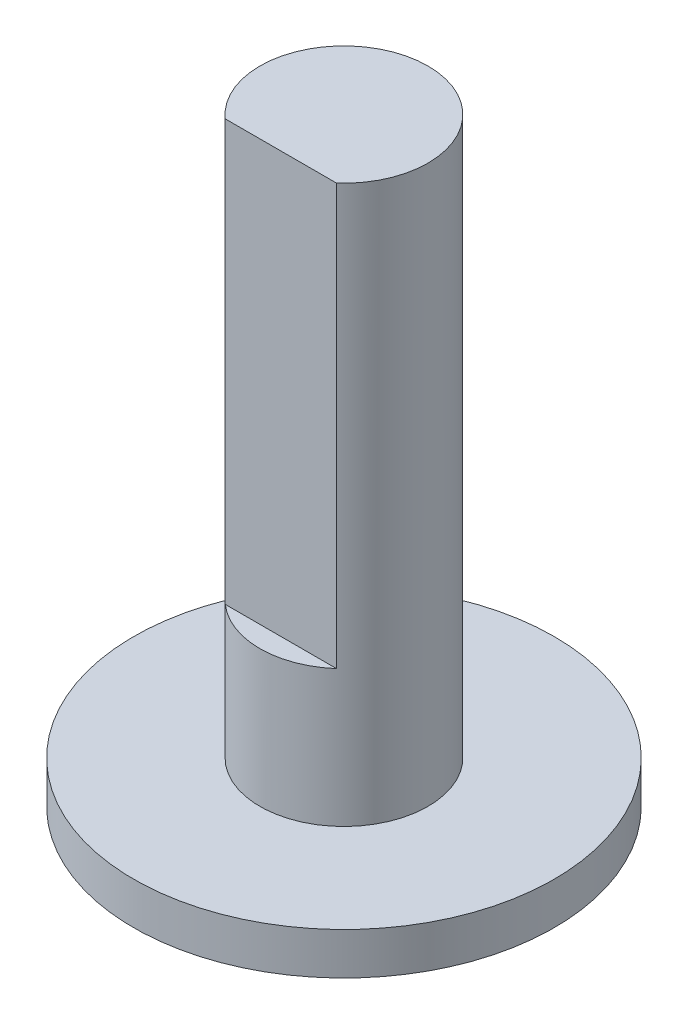
ISO-10303-21;
HEADER;
FILE_DESCRIPTION(('STEP AP214'),'2;1');
FILE_NAME('part.step','',(''),(''),'','','');
FILE_SCHEMA(('AUTOMOTIVE_DESIGN { 1 0 10303 214 1 1 1 1 }'));
ENDSEC;
DATA;
#1=APPLICATION_CONTEXT('core data for automotive mechanical design processes');
#2=APPLICATION_PROTOCOL_DEFINITION('international standard','automotive_design',2000,#1);
#3=PRODUCT_CONTEXT('',#1,'mechanical');
#4=PRODUCT('Part','Part','',(#3));
#5=PRODUCT_RELATED_PRODUCT_CATEGORY('part','',(#4));
#6=PRODUCT_DEFINITION_FORMATION('','',#4);
#7=PRODUCT_DEFINITION_CONTEXT('part definition',#1,'design');
#8=PRODUCT_DEFINITION('design','',#6,#7);
#9=PRODUCT_DEFINITION_SHAPE('','',#8);
#10=(LENGTH_UNIT() NAMED_UNIT(*) SI_UNIT(.MILLI.,.METRE.));
#11=(NAMED_UNIT(*) PLANE_ANGLE_UNIT() SI_UNIT($,.RADIAN.));
#12=(NAMED_UNIT(*) SI_UNIT($,.STERADIAN.) SOLID_ANGLE_UNIT());
#13=UNCERTAINTY_MEASURE_WITH_UNIT(LENGTH_MEASURE(1.E-05),#10,'distance_accuracy_value','');
#14=(GEOMETRIC_REPRESENTATION_CONTEXT(3) GLOBAL_UNCERTAINTY_ASSIGNED_CONTEXT((#13)) GLOBAL_UNIT_ASSIGNED_CONTEXT((#10,
#11,#12)) REPRESENTATION_CONTEXT('',''));
#15=CARTESIAN_POINT('',(0.,0.,0.));
#16=DIRECTION('',(0.,0.,1.));
#17=DIRECTION('',(1.,0.,0.));
#18=AXIS2_PLACEMENT_3D('',#15,#16,#17);
#19=CARTESIAN_POINT('',(0.,22.5,0.));
#20=DIRECTION('',(0.,1.,0.));
#21=DIRECTION('',(0.,0.,1.));
#22=AXIS2_PLACEMENT_3D('',#19,#20,#21);
#23=PLANE('',#22);
#24=DIRECTION('',(-1.,0.,0.));
#25=VECTOR('',#24,1.);
#26=CARTESIAN_POINT('',(-2.64575131106459,22.5,3.));
#27=LINE('',#26,#25);
#28=CARTESIAN_POINT('',(2.64575131106459,22.5,3.));
#29=VERTEX_POINT('',#28);
#30=CARTESIAN_POINT('',(-2.64575131106459,22.5,3.));
#31=VERTEX_POINT('',#30);
#32=EDGE_CURVE('E66',#29,#31,#27,.T.);
#33=ORIENTED_EDGE('',*,*,#32,.F.);
#34=CARTESIAN_POINT('',(0.,22.5,0.));
#35=DIRECTION('',(0.,-1.,0.));
#36=DIRECTION('',(0.,0.,-1.));
#37=AXIS2_PLACEMENT_3D('',#34,#35,#36);
#38=CIRCLE('',#37,4.);
#39=EDGE_CURVE('E11',#31,#29,#38,.T.);
#40=ORIENTED_EDGE('',*,*,#39,.F.);
#41=EDGE_LOOP('',(#33,#40));
#42=FACE_BOUND('',#41,.T.);
#43=ADVANCED_FACE('F38',(#42),#23,.T.);
#44=CARTESIAN_POINT('',(0.,-6.,0.));
#45=DIRECTION('',(0.,-1.,0.));
#46=DIRECTION('',(0.,0.,-1.));
#47=AXIS2_PLACEMENT_3D('',#44,#45,#46);
#48=CYLINDRICAL_SURFACE('',#47,4.);
#49=DIRECTION('',(0.,1.,0.));
#50=VECTOR('',#49,1.);
#51=CARTESIAN_POINT('',(2.64575131106459,2.5,3.));
#52=LINE('',#51,#50);
#53=CARTESIAN_POINT('',(2.64575131106459,2.5,3.));
#54=VERTEX_POINT('',#53);
#55=EDGE_CURVE('E63',#54,#29,#52,.T.);
#56=ORIENTED_EDGE('',*,*,#55,.F.);
#57=CARTESIAN_POINT('',(0.,2.5,0.));
#58=DIRECTION('',(0.,1.,0.));
#59=DIRECTION('',(0.,0.,1.));
#60=AXIS2_PLACEMENT_3D('',#57,#58,#59);
#61=CIRCLE('',#60,4.);
#62=CARTESIAN_POINT('',(-2.64575131106459,2.5,3.));
#63=VERTEX_POINT('',#62);
#64=EDGE_CURVE('E56',#63,#54,#61,.T.);
#65=ORIENTED_EDGE('',*,*,#64,.F.);
#66=DIRECTION('',(0.,1.,0.));
#67=VECTOR('',#66,1.);
#68=CARTESIAN_POINT('',(-2.64575131106459,2.5,3.));
#69=LINE('',#68,#67);
#70=EDGE_CURVE('E69',#63,#31,#69,.T.);
#71=ORIENTED_EDGE('',*,*,#70,.T.);
#72=ORIENTED_EDGE('',*,*,#39,.T.);
#73=EDGE_LOOP('',(#56,#65,#71,#72));
#74=FACE_BOUND('',#73,.T.);
#75=CARTESIAN_POINT('',(0.,-4.,0.));
#76=DIRECTION('',(0.,-1.,0.));
#77=DIRECTION('',(0.,0.,-1.));
#78=AXIS2_PLACEMENT_3D('',#75,#76,#77);
#79=CIRCLE('',#78,4.);
#80=CARTESIAN_POINT('',(0.,-4.,-4.));
#81=VERTEX_POINT('',#80);
#82=EDGE_CURVE('E45',#81,#81,#79,.T.);
#83=ORIENTED_EDGE('',*,*,#82,.F.);
#84=EDGE_LOOP('',(#83));
#85=FACE_BOUND('',#84,.T.);
#86=ADVANCED_FACE('F74',(#74,#85),#48,.T.);
#87=CARTESIAN_POINT('',(4.,-4.,0.));
#88=DIRECTION('',(0.,1.,0.));
#89=DIRECTION('',(0.,0.,1.));
#90=AXIS2_PLACEMENT_3D('',#87,#88,#89);
#91=PLANE('',#90);
#92=ORIENTED_EDGE('',*,*,#82,.T.);
#93=EDGE_LOOP('',(#92));
#94=FACE_BOUND('',#93,.T.);
#95=CARTESIAN_POINT('',(0.,-4.,0.));
#96=DIRECTION('',(0.,-1.,0.));
#97=DIRECTION('',(0.,0.,-1.));
#98=AXIS2_PLACEMENT_3D('',#95,#96,#97);
#99=CIRCLE('',#98,10.);
#100=CARTESIAN_POINT('',(0.,-4.,-10.));
#101=VERTEX_POINT('',#100);
#102=EDGE_CURVE('E79',#101,#101,#99,.T.);
#103=ORIENTED_EDGE('',*,*,#102,.F.);
#104=EDGE_LOOP('',(#103));
#105=FACE_BOUND('',#104,.T.);
#106=ADVANCED_FACE('F87',(#94,#105),#91,.T.);
#107=CARTESIAN_POINT('',(0.,-6.,0.));
#108=DIRECTION('',(0.,-1.,0.));
#109=DIRECTION('',(0.,0.,-1.));
#110=AXIS2_PLACEMENT_3D('',#107,#108,#109);
#111=CYLINDRICAL_SURFACE('',#110,10.);
#112=ORIENTED_EDGE('',*,*,#102,.T.);
#113=EDGE_LOOP('',(#112));
#114=FACE_BOUND('',#113,.T.);
#115=CARTESIAN_POINT('',(0.,-6.,0.));
#116=DIRECTION('',(0.,-1.,0.));
#117=DIRECTION('',(0.,0.,-1.));
#118=AXIS2_PLACEMENT_3D('',#115,#116,#117);
#119=CIRCLE('',#118,10.);
#120=CARTESIAN_POINT('',(0.,-6.,-10.));
#121=VERTEX_POINT('',#120);
#122=EDGE_CURVE('E76',#121,#121,#119,.T.);
#123=ORIENTED_EDGE('',*,*,#122,.F.);
#124=EDGE_LOOP('',(#123));
#125=FACE_BOUND('',#124,.T.);
#126=ADVANCED_FACE('F94',(#114,#125),#111,.T.);
#127=CARTESIAN_POINT('',(10.,-6.,0.));
#128=DIRECTION('',(0.,-1.,0.));
#129=DIRECTION('',(0.,0.,-1.));
#130=AXIS2_PLACEMENT_3D('',#127,#128,#129);
#131=PLANE('',#130);
#132=ORIENTED_EDGE('',*,*,#122,.T.);
#133=EDGE_LOOP('',(#132));
#134=FACE_BOUND('',#133,.T.);
#135=ADVANCED_FACE('F99',(#134),#131,.T.);
#136=CARTESIAN_POINT('',(-2.64575131106459,2.5,3.));
#137=DIRECTION('',(0.,0.,-1.));
#138=DIRECTION('',(-1.,0.,0.));
#139=AXIS2_PLACEMENT_3D('',#136,#137,#138);
#140=PLANE('',#139);
#141=ORIENTED_EDGE('',*,*,#32,.T.);
#142=ORIENTED_EDGE('',*,*,#70,.F.);
#143=DIRECTION('',(-1.,0.,0.));
#144=VECTOR('',#143,1.);
#145=CARTESIAN_POINT('',(-2.64575131106459,2.5,3.));
#146=LINE('',#145,#144);
#147=EDGE_CURVE('E51',#54,#63,#146,.T.);
#148=ORIENTED_EDGE('',*,*,#147,.F.);
#149=ORIENTED_EDGE('',*,*,#55,.T.);
#150=EDGE_LOOP('',(#141,#142,#148,#149));
#151=FACE_BOUND('',#150,.T.);
#152=ADVANCED_FACE('F65',(#151),#140,.F.);
#153=CARTESIAN_POINT('',(0.,2.5,0.));
#154=DIRECTION('',(0.,1.,0.));
#155=DIRECTION('',(0.,0.,1.));
#156=AXIS2_PLACEMENT_3D('',#153,#154,#155);
#157=PLANE('',#156);
#158=ORIENTED_EDGE('',*,*,#64,.T.);
#159=ORIENTED_EDGE('',*,*,#147,.T.);
#160=EDGE_LOOP('',(#158,#159));
#161=FACE_BOUND('',#160,.T.);
#162=ADVANCED_FACE('F106',(#161),#157,.T.);
#163=CLOSED_SHELL('',(#43,#86,#106,#126,#135,#152,#162));
#164=MANIFOLD_SOLID_BREP('B2',#163);
#165=ADVANCED_BREP_SHAPE_REPRESENTATION('',(#18,#164),#14);
#166=SHAPE_DEFINITION_REPRESENTATION(#9,#165);
ENDSEC;
END-ISO-10303-21;
